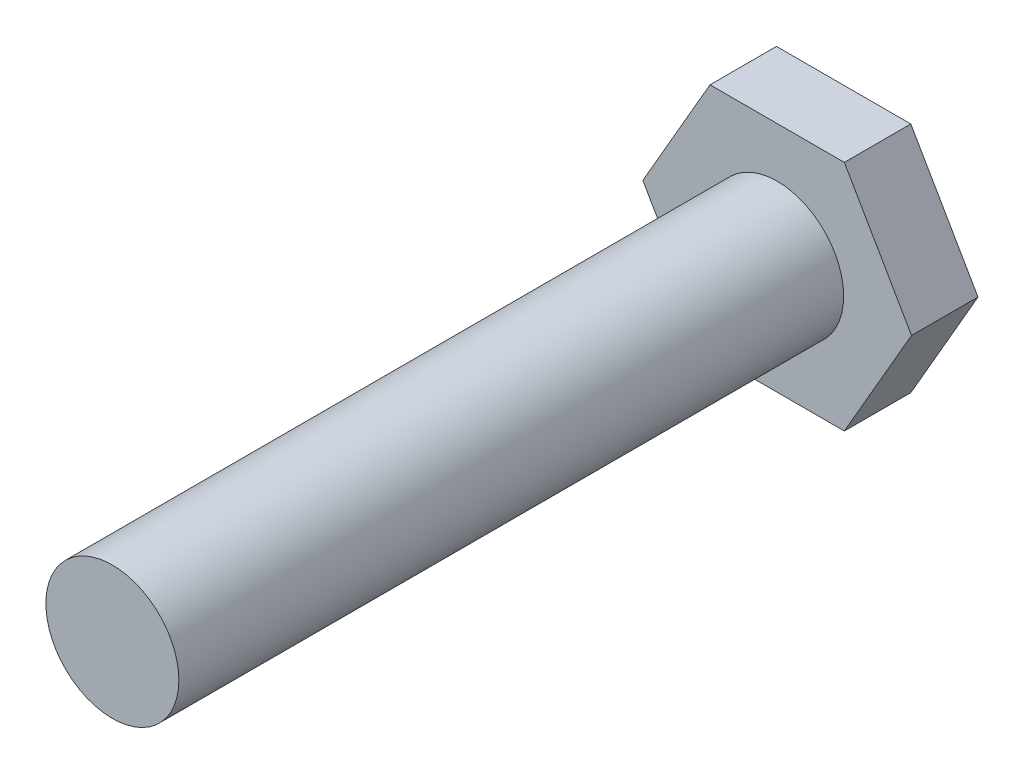
ISO-10303-21;
HEADER;
FILE_DESCRIPTION(('STEP AP214'),'2;1');
FILE_NAME('part.step','',(''),(''),'','','');
FILE_SCHEMA(('AUTOMOTIVE_DESIGN { 1 0 10303 214 1 1 1 1 }'));
ENDSEC;
DATA;
#1=APPLICATION_CONTEXT('core data for automotive mechanical design processes');
#2=APPLICATION_PROTOCOL_DEFINITION('international standard','automotive_design',2000,#1);
#3=PRODUCT_CONTEXT('',#1,'mechanical');
#4=PRODUCT('Part','Part','',(#3));
#5=PRODUCT_RELATED_PRODUCT_CATEGORY('part','',(#4));
#6=PRODUCT_DEFINITION_FORMATION('','',#4);
#7=PRODUCT_DEFINITION_CONTEXT('part definition',#1,'design');
#8=PRODUCT_DEFINITION('design','',#6,#7);
#9=PRODUCT_DEFINITION_SHAPE('','',#8);
#10=(LENGTH_UNIT() NAMED_UNIT(*) SI_UNIT(.MILLI.,.METRE.));
#11=(NAMED_UNIT(*) PLANE_ANGLE_UNIT() SI_UNIT($,.RADIAN.));
#12=(NAMED_UNIT(*) SI_UNIT($,.STERADIAN.) SOLID_ANGLE_UNIT());
#13=UNCERTAINTY_MEASURE_WITH_UNIT(LENGTH_MEASURE(1.E-05),#10,'distance_accuracy_value','');
#14=(GEOMETRIC_REPRESENTATION_CONTEXT(3) GLOBAL_UNCERTAINTY_ASSIGNED_CONTEXT((#13)) GLOBAL_UNIT_ASSIGNED_CONTEXT((#10,
#11,#12)) REPRESENTATION_CONTEXT('',''));
#15=CARTESIAN_POINT('',(0.,0.,0.));
#16=DIRECTION('',(0.,0.,1.));
#17=DIRECTION('',(1.,0.,0.));
#18=AXIS2_PLACEMENT_3D('',#15,#16,#17);
#19=CARTESIAN_POINT('',(0.,0.,100.));
#20=DIRECTION('',(0.,0.,-1.));
#21=DIRECTION('',(-1.,0.,0.));
#22=AXIS2_PLACEMENT_3D('',#19,#20,#21);
#23=CYLINDRICAL_SURFACE('',#22,10.);
#24=CARTESIAN_POINT('',(0.,0.,100.));
#25=DIRECTION('',(0.,0.,1.));
#26=DIRECTION('',(1.,0.,0.));
#27=AXIS2_PLACEMENT_3D('',#24,#25,#26);
#28=CIRCLE('',#27,10.);
#29=CARTESIAN_POINT('',(10.,0.,100.));
#30=VERTEX_POINT('',#29);
#31=EDGE_CURVE('E11',#30,#30,#28,.T.);
#32=ORIENTED_EDGE('',*,*,#31,.F.);
#33=EDGE_LOOP('',(#32));
#34=FACE_BOUND('',#33,.T.);
#35=CARTESIAN_POINT('',(0.,0.,0.));
#36=DIRECTION('',(0.,0.,1.));
#37=DIRECTION('',(1.,0.,0.));
#38=AXIS2_PLACEMENT_3D('',#35,#36,#37);
#39=CIRCLE('',#38,10.);
#40=CARTESIAN_POINT('',(10.,0.,0.));
#41=VERTEX_POINT('',#40);
#42=EDGE_CURVE('E47',#41,#41,#39,.T.);
#43=ORIENTED_EDGE('',*,*,#42,.T.);
#44=EDGE_LOOP('',(#43));
#45=FACE_BOUND('',#44,.T.);
#46=ADVANCED_FACE('F44',(#34,#45),#23,.T.);
#47=CARTESIAN_POINT('',(0.,0.,100.));
#48=DIRECTION('',(0.,0.,1.));
#49=DIRECTION('',(1.,0.,0.));
#50=AXIS2_PLACEMENT_3D('',#47,#48,#49);
#51=PLANE('',#50);
#52=ORIENTED_EDGE('',*,*,#31,.T.);
#53=EDGE_LOOP('',(#52));
#54=FACE_BOUND('',#53,.T.);
#55=ADVANCED_FACE('F188',(#54),#51,.T.);
#56=CARTESIAN_POINT('',(-10.1036297108185,-17.5,-10.));
#57=DIRECTION('',(0.866025403784439,0.5,0.));
#58=DIRECTION('',(-0.5,0.866025403784439,0.));
#59=AXIS2_PLACEMENT_3D('',#56,#57,#58);
#60=PLANE('',#59);
#61=DIRECTION('',(-0.5,0.866025403784439,0.));
#62=VECTOR('',#61,1.);
#63=CARTESIAN_POINT('',(-10.1036297108185,-17.5,0.));
#64=LINE('',#63,#62);
#65=CARTESIAN_POINT('',(-10.1036297108185,-17.5,0.));
#66=VERTEX_POINT('',#65);
#67=CARTESIAN_POINT('',(-20.2072594216369,0.,0.));
#68=VERTEX_POINT('',#67);
#69=EDGE_CURVE('E134',#66,#68,#64,.T.);
#70=ORIENTED_EDGE('',*,*,#69,.T.);
#71=DIRECTION('',(0.,0.,1.));
#72=VECTOR('',#71,1.);
#73=CARTESIAN_POINT('',(-20.2072594216369,0.,-10.));
#74=LINE('',#73,#72);
#75=CARTESIAN_POINT('',(-20.2072594216369,0.,-10.));
#76=VERTEX_POINT('',#75);
#77=EDGE_CURVE('E161',#76,#68,#74,.T.);
#78=ORIENTED_EDGE('',*,*,#77,.F.);
#79=DIRECTION('',(-0.5,0.866025403784439,0.));
#80=VECTOR('',#79,1.);
#81=CARTESIAN_POINT('',(-10.1036297108185,-17.5,-10.));
#82=LINE('',#81,#80);
#83=CARTESIAN_POINT('',(-10.1036297108185,-17.5,-10.));
#84=VERTEX_POINT('',#83);
#85=EDGE_CURVE('E150',#84,#76,#82,.T.);
#86=ORIENTED_EDGE('',*,*,#85,.F.);
#87=DIRECTION('',(0.,0.,1.));
#88=VECTOR('',#87,1.);
#89=CARTESIAN_POINT('',(-10.1036297108185,-17.5,-10.));
#90=LINE('',#89,#88);
#91=EDGE_CURVE('E130',#84,#66,#90,.T.);
#92=ORIENTED_EDGE('',*,*,#91,.T.);
#93=EDGE_LOOP('',(#70,#78,#86,#92));
#94=FACE_BOUND('',#93,.T.);
#95=ADVANCED_FACE('F176',(#94),#60,.F.);
#96=CARTESIAN_POINT('',(-20.2072594216369,0.,-10.));
#97=DIRECTION('',(0.866025403784439,-0.5,0.));
#98=DIRECTION('',(0.5,0.866025403784439,0.));
#99=AXIS2_PLACEMENT_3D('',#96,#97,#98);
#100=PLANE('',#99);
#101=DIRECTION('',(0.5,0.866025403784439,0.));
#102=VECTOR('',#101,1.);
#103=CARTESIAN_POINT('',(-20.2072594216369,0.,0.));
#104=LINE('',#103,#102);
#105=CARTESIAN_POINT('',(-10.1036297108184,17.5,0.));
#106=VERTEX_POINT('',#105);
#107=EDGE_CURVE('E138',#68,#106,#104,.T.);
#108=ORIENTED_EDGE('',*,*,#107,.T.);
#109=DIRECTION('',(0.,0.,1.));
#110=VECTOR('',#109,1.);
#111=CARTESIAN_POINT('',(-10.1036297108184,17.5,-10.));
#112=LINE('',#111,#110);
#113=CARTESIAN_POINT('',(-10.1036297108184,17.5,-10.));
#114=VERTEX_POINT('',#113);
#115=EDGE_CURVE('E157',#114,#106,#112,.T.);
#116=ORIENTED_EDGE('',*,*,#115,.F.);
#117=DIRECTION('',(0.5,0.866025403784439,0.));
#118=VECTOR('',#117,1.);
#119=CARTESIAN_POINT('',(-20.2072594216369,0.,-10.));
#120=LINE('',#119,#118);
#121=EDGE_CURVE('E99',#76,#114,#120,.T.);
#122=ORIENTED_EDGE('',*,*,#121,.F.);
#123=ORIENTED_EDGE('',*,*,#77,.T.);
#124=EDGE_LOOP('',(#108,#116,#122,#123));
#125=FACE_BOUND('',#124,.T.);
#126=ADVANCED_FACE('F198',(#125),#100,.F.);
#127=CARTESIAN_POINT('',(-10.1036297108184,17.5,-10.));
#128=DIRECTION('',(0.,-1.,0.));
#129=DIRECTION('',(1.,0.,0.));
#130=AXIS2_PLACEMENT_3D('',#127,#128,#129);
#131=PLANE('',#130);
#132=DIRECTION('',(1.,0.,0.));
#133=VECTOR('',#132,1.);
#134=CARTESIAN_POINT('',(-10.1036297108184,17.5,0.));
#135=LINE('',#134,#133);
#136=CARTESIAN_POINT('',(10.1036297108185,17.5,0.));
#137=VERTEX_POINT('',#136);
#138=EDGE_CURVE('E141',#106,#137,#135,.T.);
#139=ORIENTED_EDGE('',*,*,#138,.T.);
#140=DIRECTION('',(0.,0.,1.));
#141=VECTOR('',#140,1.);
#142=CARTESIAN_POINT('',(10.1036297108185,17.5,-10.));
#143=LINE('',#142,#141);
#144=CARTESIAN_POINT('',(10.1036297108185,17.5,-10.));
#145=VERTEX_POINT('',#144);
#146=EDGE_CURVE('E123',#145,#137,#143,.T.);
#147=ORIENTED_EDGE('',*,*,#146,.F.);
#148=DIRECTION('',(1.,0.,0.));
#149=VECTOR('',#148,1.);
#150=CARTESIAN_POINT('',(-10.1036297108184,17.5,-10.));
#151=LINE('',#150,#149);
#152=EDGE_CURVE('E112',#114,#145,#151,.T.);
#153=ORIENTED_EDGE('',*,*,#152,.F.);
#154=ORIENTED_EDGE('',*,*,#115,.T.);
#155=EDGE_LOOP('',(#139,#147,#153,#154));
#156=FACE_BOUND('',#155,.T.);
#157=ADVANCED_FACE('F203',(#156),#131,.F.);
#158=CARTESIAN_POINT('',(10.1036297108185,17.5,-10.));
#159=DIRECTION('',(-0.866025403784439,-0.5,0.));
#160=DIRECTION('',(0.5,-0.866025403784439,0.));
#161=AXIS2_PLACEMENT_3D('',#158,#159,#160);
#162=PLANE('',#161);
#163=DIRECTION('',(0.5,-0.866025403784439,0.));
#164=VECTOR('',#163,1.);
#165=CARTESIAN_POINT('',(10.1036297108185,17.5,0.));
#166=LINE('',#165,#164);
#167=CARTESIAN_POINT('',(20.2072594216369,0.,0.));
#168=VERTEX_POINT('',#167);
#169=EDGE_CURVE('E121',#137,#168,#166,.T.);
#170=ORIENTED_EDGE('',*,*,#169,.T.);
#171=DIRECTION('',(0.,0.,1.));
#172=VECTOR('',#171,1.);
#173=CARTESIAN_POINT('',(20.2072594216369,0.,-10.));
#174=LINE('',#173,#172);
#175=CARTESIAN_POINT('',(20.2072594216369,0.,-10.));
#176=VERTEX_POINT('',#175);
#177=EDGE_CURVE('E118',#176,#168,#174,.T.);
#178=ORIENTED_EDGE('',*,*,#177,.F.);
#179=DIRECTION('',(0.5,-0.866025403784439,0.));
#180=VECTOR('',#179,1.);
#181=CARTESIAN_POINT('',(10.1036297108185,17.5,-10.));
#182=LINE('',#181,#180);
#183=EDGE_CURVE('E106',#145,#176,#182,.T.);
#184=ORIENTED_EDGE('',*,*,#183,.F.);
#185=ORIENTED_EDGE('',*,*,#146,.T.);
#186=EDGE_LOOP('',(#170,#178,#184,#185));
#187=FACE_BOUND('',#186,.T.);
#188=ADVANCED_FACE('F119',(#187),#162,.F.);
#189=CARTESIAN_POINT('',(20.2072594216369,0.,-10.));
#190=DIRECTION('',(-0.866025403784439,0.5,0.));
#191=DIRECTION('',(-0.5,-0.866025403784439,0.));
#192=AXIS2_PLACEMENT_3D('',#189,#190,#191);
#193=PLANE('',#192);
#194=DIRECTION('',(-0.5,-0.866025403784439,0.));
#195=VECTOR('',#194,1.);
#196=CARTESIAN_POINT('',(20.2072594216369,0.,0.));
#197=LINE('',#196,#195);
#198=CARTESIAN_POINT('',(10.1036297108185,-17.5,0.));
#199=VERTEX_POINT('',#198);
#200=EDGE_CURVE('E84',#168,#199,#197,.T.);
#201=ORIENTED_EDGE('',*,*,#200,.T.);
#202=DIRECTION('',(0.,0.,1.));
#203=VECTOR('',#202,1.);
#204=CARTESIAN_POINT('',(10.1036297108185,-17.5,-10.));
#205=LINE('',#204,#203);
#206=CARTESIAN_POINT('',(10.1036297108185,-17.5,-10.));
#207=VERTEX_POINT('',#206);
#208=EDGE_CURVE('E124',#207,#199,#205,.T.);
#209=ORIENTED_EDGE('',*,*,#208,.F.);
#210=DIRECTION('',(-0.5,-0.866025403784439,0.));
#211=VECTOR('',#210,1.);
#212=CARTESIAN_POINT('',(20.2072594216369,0.,-10.));
#213=LINE('',#212,#211);
#214=EDGE_CURVE('E110',#176,#207,#213,.T.);
#215=ORIENTED_EDGE('',*,*,#214,.F.);
#216=ORIENTED_EDGE('',*,*,#177,.T.);
#217=EDGE_LOOP('',(#201,#209,#215,#216));
#218=FACE_BOUND('',#217,.T.);
#219=ADVANCED_FACE('F126',(#218),#193,.F.);
#220=CARTESIAN_POINT('',(10.1036297108185,-17.5,-10.));
#221=DIRECTION('',(0.,1.,0.));
#222=DIRECTION('',(-1.,0.,0.));
#223=AXIS2_PLACEMENT_3D('',#220,#221,#222);
#224=PLANE('',#223);
#225=DIRECTION('',(-1.,0.,0.));
#226=VECTOR('',#225,1.);
#227=CARTESIAN_POINT('',(10.1036297108185,-17.5,0.));
#228=LINE('',#227,#226);
#229=EDGE_CURVE('E90',#199,#66,#228,.T.);
#230=ORIENTED_EDGE('',*,*,#229,.T.);
#231=ORIENTED_EDGE('',*,*,#91,.F.);
#232=DIRECTION('',(-1.,0.,0.));
#233=VECTOR('',#232,1.);
#234=CARTESIAN_POINT('',(10.1036297108185,-17.5,-10.));
#235=LINE('',#234,#233);
#236=EDGE_CURVE('E61',#207,#84,#235,.T.);
#237=ORIENTED_EDGE('',*,*,#236,.F.);
#238=ORIENTED_EDGE('',*,*,#208,.T.);
#239=EDGE_LOOP('',(#230,#231,#237,#238));
#240=FACE_BOUND('',#239,.T.);
#241=ADVANCED_FACE('F178',(#240),#224,.F.);
#242=CARTESIAN_POINT('',(0.,0.,-10.));
#243=DIRECTION('',(0.,0.,-1.));
#244=DIRECTION('',(-1.,0.,0.));
#245=AXIS2_PLACEMENT_3D('',#242,#243,#244);
#246=PLANE('',#245);
#247=ORIENTED_EDGE('',*,*,#85,.T.);
#248=ORIENTED_EDGE('',*,*,#121,.T.);
#249=ORIENTED_EDGE('',*,*,#152,.T.);
#250=ORIENTED_EDGE('',*,*,#183,.T.);
#251=ORIENTED_EDGE('',*,*,#214,.T.);
#252=ORIENTED_EDGE('',*,*,#236,.T.);
#253=EDGE_LOOP('',(#247,#248,#249,#250,#251,#252));
#254=FACE_BOUND('',#253,.T.);
#255=ADVANCED_FACE('F108',(#254),#246,.T.);
#256=CARTESIAN_POINT('',(0.,0.,0.));
#257=DIRECTION('',(0.,0.,-1.));
#258=DIRECTION('',(-1.,0.,0.));
#259=AXIS2_PLACEMENT_3D('',#256,#257,#258);
#260=PLANE('',#259);
#261=ORIENTED_EDGE('',*,*,#42,.F.);
#262=EDGE_LOOP('',(#261));
#263=FACE_BOUND('',#262,.T.);
#264=ORIENTED_EDGE('',*,*,#69,.F.);
#265=ORIENTED_EDGE('',*,*,#229,.F.);
#266=ORIENTED_EDGE('',*,*,#200,.F.);
#267=ORIENTED_EDGE('',*,*,#169,.F.);
#268=ORIENTED_EDGE('',*,*,#138,.F.);
#269=ORIENTED_EDGE('',*,*,#107,.F.);
#270=EDGE_LOOP('',(#264,#265,#266,#267,#268,#269));
#271=FACE_BOUND('',#270,.T.);
#272=ADVANCED_FACE('F169',(#263,#271),#260,.F.);
#273=CLOSED_SHELL('',(#46,#55,#95,#126,#157,#188,#219,#241,#255,#272));
#274=MANIFOLD_SOLID_BREP('B2',#273);
#275=ADVANCED_BREP_SHAPE_REPRESENTATION('',(#18,#274),#14);
#276=SHAPE_DEFINITION_REPRESENTATION(#9,#275);
ENDSEC;
END-ISO-10303-21;
